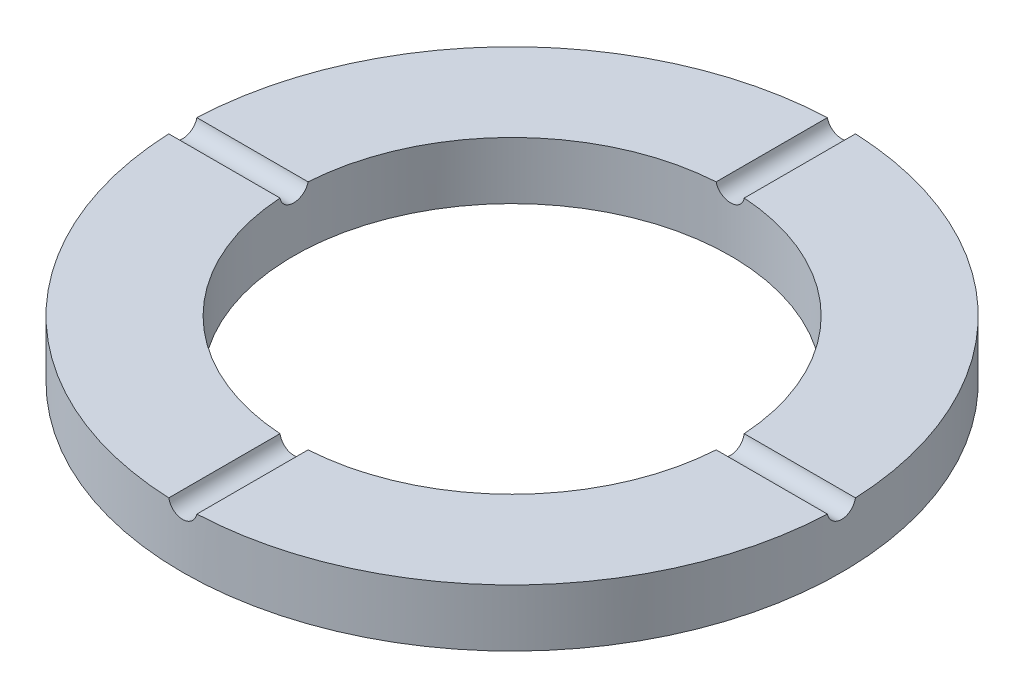
ISO-10303-21;
HEADER;
FILE_DESCRIPTION(('STEP AP214'),'2;1');
FILE_NAME('part.step','',(''),(''),'','','');
FILE_SCHEMA(('AUTOMOTIVE_DESIGN { 1 0 10303 214 1 1 1 1 }'));
ENDSEC;
DATA;
#1=APPLICATION_CONTEXT('core data for automotive mechanical design processes');
#2=APPLICATION_PROTOCOL_DEFINITION('international standard','automotive_design',2000,#1);
#3=PRODUCT_CONTEXT('',#1,'mechanical');
#4=PRODUCT('Part','Part','',(#3));
#5=PRODUCT_RELATED_PRODUCT_CATEGORY('part','',(#4));
#6=PRODUCT_DEFINITION_FORMATION('','',#4);
#7=PRODUCT_DEFINITION_CONTEXT('part definition',#1,'design');
#8=PRODUCT_DEFINITION('design','',#6,#7);
#9=PRODUCT_DEFINITION_SHAPE('','',#8);
#10=(LENGTH_UNIT() NAMED_UNIT(*) SI_UNIT(.MILLI.,.METRE.));
#11=(NAMED_UNIT(*) PLANE_ANGLE_UNIT() SI_UNIT($,.RADIAN.));
#12=(NAMED_UNIT(*) SI_UNIT($,.STERADIAN.) SOLID_ANGLE_UNIT());
#13=UNCERTAINTY_MEASURE_WITH_UNIT(LENGTH_MEASURE(1.E-05),#10,'distance_accuracy_value','');
#14=(GEOMETRIC_REPRESENTATION_CONTEXT(3) GLOBAL_UNCERTAINTY_ASSIGNED_CONTEXT((#13)) GLOBAL_UNIT_ASSIGNED_CONTEXT((#10,
#11,#12)) REPRESENTATION_CONTEXT('',''));
#15=CARTESIAN_POINT('',(0.,0.,0.));
#16=DIRECTION('',(0.,0.,1.));
#17=DIRECTION('',(1.,0.,0.));
#18=AXIS2_PLACEMENT_3D('',#15,#16,#17);
#19=CARTESIAN_POINT('',(0.,4.,0.));
#20=DIRECTION('',(0.,1.,0.));
#21=DIRECTION('',(0.,0.,1.));
#22=AXIS2_PLACEMENT_3D('',#19,#20,#21);
#23=PLANE('',#22);
#24=DIRECTION('',(1.,0.,0.));
#25=VECTOR('',#24,1.);
#26=CARTESIAN_POINT('',(-23.,4.,0.979795897113271));
#27=LINE('',#26,#25);
#28=CARTESIAN_POINT('',(-22.9791209579479,4.,0.979795897113271));
#29=VERTEX_POINT('',#28);
#30=CARTESIAN_POINT('',(-15.2184920409349,4.,0.979795897113271));
#31=VERTEX_POINT('',#30);
#32=EDGE_CURVE('E67',#29,#31,#27,.T.);
#33=ORIENTED_EDGE('',*,*,#32,.F.);
#34=CARTESIAN_POINT('',(0.,4.,0.));
#35=DIRECTION('',(0.,1.,0.));
#36=DIRECTION('',(0.,0.,1.));
#37=AXIS2_PLACEMENT_3D('',#34,#35,#36);
#38=CIRCLE('',#37,23.);
#39=CARTESIAN_POINT('',(-0.979795897113268,4.,22.9791209579479));
#40=VERTEX_POINT('',#39);
#41=EDGE_CURVE('E145',#29,#40,#38,.T.);
#42=ORIENTED_EDGE('',*,*,#41,.T.);
#43=DIRECTION('',(0.,0.,1.));
#44=VECTOR('',#43,1.);
#45=CARTESIAN_POINT('',(-0.979795897113268,4.,-23.));
#46=LINE('',#45,#44);
#47=CARTESIAN_POINT('',(-0.979795897113268,4.,15.2184920409349));
#48=VERTEX_POINT('',#47);
#49=EDGE_CURVE('E182',#48,#40,#46,.T.);
#50=ORIENTED_EDGE('',*,*,#49,.F.);
#51=CARTESIAN_POINT('',(0.,4.,0.));
#52=DIRECTION('',(0.,1.,0.));
#53=DIRECTION('',(0.,0.,1.));
#54=AXIS2_PLACEMENT_3D('',#51,#52,#53);
#55=CIRCLE('',#54,15.25);
#56=EDGE_CURVE('E134',#31,#48,#55,.T.);
#57=ORIENTED_EDGE('',*,*,#56,.F.);
#58=EDGE_LOOP('',(#33,#42,#50,#57));
#59=FACE_BOUND('',#58,.T.);
#60=ADVANCED_FACE('F41',(#59),#23,.T.);
#61=DIRECTION('',(1.,0.,0.));
#62=VECTOR('',#61,1.);
#63=CARTESIAN_POINT('',(-23.,4.,0.979795897113271));
#64=LINE('',#63,#62);
#65=CARTESIAN_POINT('',(15.2184920409349,4.,0.979795897113271));
#66=VERTEX_POINT('',#65);
#67=CARTESIAN_POINT('',(22.9791209579479,4.,0.979795897113271));
#68=VERTEX_POINT('',#67);
#69=EDGE_CURVE('E201',#66,#68,#64,.T.);
#70=ORIENTED_EDGE('',*,*,#69,.F.);
#71=CARTESIAN_POINT('',(0.979795897113275,4.,15.2184920409349));
#72=VERTEX_POINT('',#71);
#73=EDGE_CURVE('E135',#72,#66,#55,.T.);
#74=ORIENTED_EDGE('',*,*,#73,.F.);
#75=DIRECTION('',(0.,0.,1.));
#76=VECTOR('',#75,1.);
#77=CARTESIAN_POINT('',(0.979795897113275,4.,-23.));
#78=LINE('',#77,#76);
#79=CARTESIAN_POINT('',(0.979795897113275,4.,22.9791209579479));
#80=VERTEX_POINT('',#79);
#81=EDGE_CURVE('E199',#80,#72,#78,.F.);
#82=ORIENTED_EDGE('',*,*,#81,.F.);
#83=EDGE_CURVE('E149',#80,#68,#38,.T.);
#84=ORIENTED_EDGE('',*,*,#83,.T.);
#85=EDGE_LOOP('',(#70,#74,#82,#84));
#86=FACE_BOUND('',#85,.T.);
#87=ADVANCED_FACE('F228',(#86),#23,.T.);
#88=DIRECTION('',(1.,0.,0.));
#89=VECTOR('',#88,1.);
#90=CARTESIAN_POINT('',(-23.,4.,-0.979795897113271));
#91=LINE('',#90,#89);
#92=CARTESIAN_POINT('',(-15.2184920409349,4.,-0.979795897113271));
#93=VERTEX_POINT('',#92);
#94=CARTESIAN_POINT('',(-22.9791209579479,4.,-0.979795897113271));
#95=VERTEX_POINT('',#94);
#96=EDGE_CURVE('E115',#93,#95,#91,.F.);
#97=ORIENTED_EDGE('',*,*,#96,.F.);
#98=CARTESIAN_POINT('',(-0.979795897113268,4.,-15.2184920409349));
#99=VERTEX_POINT('',#98);
#100=EDGE_CURVE('E125',#99,#93,#55,.T.);
#101=ORIENTED_EDGE('',*,*,#100,.F.);
#102=CARTESIAN_POINT('',(-0.979795897113268,4.,-22.9791209579479));
#103=VERTEX_POINT('',#102);
#104=EDGE_CURVE('E193',#103,#99,#46,.T.);
#105=ORIENTED_EDGE('',*,*,#104,.F.);
#106=EDGE_CURVE('E121',#103,#95,#38,.T.);
#107=ORIENTED_EDGE('',*,*,#106,.T.);
#108=EDGE_LOOP('',(#97,#101,#105,#107));
#109=FACE_BOUND('',#108,.T.);
#110=ADVANCED_FACE('F119',(#109),#23,.T.);
#111=DIRECTION('',(1.,0.,0.));
#112=VECTOR('',#111,1.);
#113=CARTESIAN_POINT('',(-23.,4.,-0.979795897113271));
#114=LINE('',#113,#112);
#115=CARTESIAN_POINT('',(22.9791209579479,4.,-0.979795897113271));
#116=VERTEX_POINT('',#115);
#117=CARTESIAN_POINT('',(15.2184920409349,4.,-0.979795897113271));
#118=VERTEX_POINT('',#117);
#119=EDGE_CURVE('E64',#116,#118,#114,.F.);
#120=ORIENTED_EDGE('',*,*,#119,.F.);
#121=CARTESIAN_POINT('',(0.979795897113275,4.,-22.9791209579479));
#122=VERTEX_POINT('',#121);
#123=EDGE_CURVE('E147',#116,#122,#38,.T.);
#124=ORIENTED_EDGE('',*,*,#123,.T.);
#125=CARTESIAN_POINT('',(0.979795897113275,4.,-15.2184920409349));
#126=VERTEX_POINT('',#125);
#127=EDGE_CURVE('E185',#126,#122,#78,.F.);
#128=ORIENTED_EDGE('',*,*,#127,.F.);
#129=EDGE_CURVE('E126',#118,#126,#55,.T.);
#130=ORIENTED_EDGE('',*,*,#129,.F.);
#131=EDGE_LOOP('',(#120,#124,#128,#130));
#132=FACE_BOUND('',#131,.T.);
#133=ADVANCED_FACE('F227',(#132),#23,.T.);
#134=CARTESIAN_POINT('',(0.,0.,0.));
#135=DIRECTION('',(0.,1.,0.));
#136=DIRECTION('',(0.,0.,1.));
#137=AXIS2_PLACEMENT_3D('',#134,#135,#136);
#138=PLANE('',#137);
#139=CARTESIAN_POINT('',(0.,0.,0.));
#140=DIRECTION('',(0.,1.,0.));
#141=DIRECTION('',(0.,0.,1.));
#142=AXIS2_PLACEMENT_3D('',#139,#140,#141);
#143=CIRCLE('',#142,23.);
#144=CARTESIAN_POINT('',(0.,0.,23.));
#145=VERTEX_POINT('',#144);
#146=EDGE_CURVE('E140',#145,#145,#143,.T.);
#147=ORIENTED_EDGE('',*,*,#146,.F.);
#148=EDGE_LOOP('',(#147));
#149=FACE_BOUND('',#148,.T.);
#150=CARTESIAN_POINT('',(0.,0.,0.));
#151=DIRECTION('',(0.,1.,0.));
#152=DIRECTION('',(0.,0.,1.));
#153=AXIS2_PLACEMENT_3D('',#150,#151,#152);
#154=CIRCLE('',#153,15.25);
#155=CARTESIAN_POINT('',(0.,0.,15.25));
#156=VERTEX_POINT('',#155);
#157=EDGE_CURVE('E133',#156,#156,#154,.T.);
#158=ORIENTED_EDGE('',*,*,#157,.T.);
#159=EDGE_LOOP('',(#158));
#160=FACE_BOUND('',#159,.T.);
#161=ADVANCED_FACE('F231',(#149,#160),#138,.F.);
#162=CARTESIAN_POINT('',(0.,4.,0.));
#163=DIRECTION('',(0.,-1.,0.));
#164=DIRECTION('',(0.,0.,-1.));
#165=AXIS2_PLACEMENT_3D('',#162,#163,#164);
#166=CYLINDRICAL_SURFACE('',#165,23.);
#167=ORIENTED_EDGE('',*,*,#123,.F.);
#168=CARTESIAN_POINT('',(22.9791209579479,4.,-0.979795897113271));
#169=CARTESIAN_POINT('',(22.9793605933443,3.97243645561043,-0.974169331650632));
#170=CARTESIAN_POINT('',(22.9796482170886,3.94512405869499,-0.96738204484093));
#171=CARTESIAN_POINT('',(22.9803100555091,3.89116997405567,-0.951533164959077));
#172=CARTESIAN_POINT('',(22.9806842656179,3.86452825103485,-0.942471691851717));
#173=CARTESIAN_POINT('',(22.9819214042175,3.78594249574225,-0.911978649978518));
#174=CARTESIAN_POINT('',(22.9828996802334,3.73524730932459,-0.887219875909626));
#175=CARTESIAN_POINT('',(22.9850533463545,3.63873833259982,-0.829548757759613));
#176=CARTESIAN_POINT('',(22.9862288235259,3.59292671311011,-0.796632809130334));
#177=CARTESIAN_POINT('',(22.9886441298142,3.5074798753299,-0.72358328255691));
#178=CARTESIAN_POINT('',(22.9898839471065,3.46784352745809,-0.683451027520204));
#179=CARTESIAN_POINT('',(22.9922890850787,3.3958502639031,-0.597081375350443));
#180=CARTESIAN_POINT('',(22.9934543674017,3.36349707500685,-0.550840871746755));
#181=CARTESIAN_POINT('',(22.9955785967626,3.30700791783335,-0.453572897674949));
#182=CARTESIAN_POINT('',(22.9965375137627,3.28287314550116,-0.40254473188253));
#183=CARTESIAN_POINT('',(22.9981404073769,3.24352148841311,-0.297171590950273));
#184=CARTESIAN_POINT('',(22.998784480735,3.22830186395662,-0.242827640453661));
#185=CARTESIAN_POINT('',(22.9996854626633,3.20720401966329,-0.132356136819583));
#186=CARTESIAN_POINT('',(22.9999423971707,3.20132517401863,-0.0762287034278345));
#187=CARTESIAN_POINT('',(23.0000401606194,3.1990760370291,0.036170179634855));
#188=CARTESIAN_POINT('',(22.9998813329291,3.20269789927507,0.0924414721448019));
#189=CARTESIAN_POINT('',(22.9991661826682,3.21933032589601,0.203578219739285));
#190=CARTESIAN_POINT('',(22.9986098468413,3.23234120337819,0.258443627876853));
#191=CARTESIAN_POINT('',(22.9971623576244,3.26737968938369,0.365206365790732));
#192=CARTESIAN_POINT('',(22.9962712270226,3.28940668422677,0.417103897301028));
#193=CARTESIAN_POINT('',(22.9942545145306,3.3418485678543,0.516460249801761));
#194=CARTESIAN_POINT('',(22.9931289566155,3.37226259899689,0.563919523975536));
#195=CARTESIAN_POINT('',(22.9907691923438,3.44063659437221,0.65308952735128));
#196=CARTESIAN_POINT('',(22.9895349232469,3.47860093220904,0.694796900872739));
#197=CARTESIAN_POINT('',(22.9870965818358,3.56101509652297,0.771271122998882));
#198=CARTESIAN_POINT('',(22.9858925260044,3.60546837657989,0.806034252218731));
#199=CARTESIAN_POINT('',(22.9836495095539,3.69963666814406,0.867645839559928));
#200=CARTESIAN_POINT('',(22.9826107735201,3.74935868707701,0.894483572719542));
#201=CARTESIAN_POINT('',(22.9808201195405,3.85253135165495,0.939370438838652));
#202=CARTESIAN_POINT('',(22.9800675429947,3.90597309648986,0.957439779197949));
#203=CARTESIAN_POINT('',(22.9793620765943,3.97359546817615,0.974128170930274));
#204=CARTESIAN_POINT('',(22.9792358980224,3.9867728273016,0.977097597872887));
#205=CARTESIAN_POINT('',(22.9791209579479,4.,0.979795897113271));
#206=B_SPLINE_CURVE_WITH_KNOTS('',3,(#168,#169,#170,#171,#172,#173,#174,#175,#176,#177,#178,
#179,#180,#181,#182,#183,#184,#185,#186,#187,#188,#189,#190,#191,#192,#193,#194,#195,#196,#197,
#198,#199,#200,#201,#202,#203,#204,#205),.UNSPECIFIED.,.F.,.F.,(4,2,2,2,2,2,2,2,2,2,2,2,2,2,2,2,
2,2,4),(0.,0.0843470124205131,0.168689576416623,0.337100862154551,0.505586699737592,
0.674041681598095,0.842582666795663,1.01114816762904,1.17966183963974,1.34816422119762,
1.5165274844601,1.68489636260193,1.85325378265443,2.02159399318777,2.19003200229103,
2.35855998746789,2.52731499720698,2.69567922964191,2.73619196885866),.UNSPECIFIED.);
#207=EDGE_CURVE('E197',#116,#68,#206,.T.);
#208=ORIENTED_EDGE('',*,*,#207,.T.);
#209=ORIENTED_EDGE('',*,*,#83,.F.);
#210=CARTESIAN_POINT('',(0.979795897113275,4.,22.9791209579479));
#211=CARTESIAN_POINT('',(0.974169331650636,3.97243645561043,22.9793605933443));
#212=CARTESIAN_POINT('',(0.967382044840934,3.94512405869499,22.9796482170886));
#213=CARTESIAN_POINT('',(0.951533164959081,3.89116997405567,22.9803100555091));
#214=CARTESIAN_POINT('',(0.942471691851721,3.86452825103485,22.9806842656179));
#215=CARTESIAN_POINT('',(0.911978649978522,3.78594249574225,22.9819214042175));
#216=CARTESIAN_POINT('',(0.887219875909631,3.73524730932459,22.9828996802334));
#217=CARTESIAN_POINT('',(0.829548757759617,3.63873833259982,22.9850533463545));
#218=CARTESIAN_POINT('',(0.796632809130338,3.59292671311011,22.9862288235259));
#219=CARTESIAN_POINT('',(0.723583282556913,3.5074798753299,22.9886441298142));
#220=CARTESIAN_POINT('',(0.683451027520208,3.46784352745809,22.9898839471065));
#221=CARTESIAN_POINT('',(0.597081375350447,3.3958502639031,22.9922890850787));
#222=CARTESIAN_POINT('',(0.550840871746759,3.36349707500685,22.9934543674017));
#223=CARTESIAN_POINT('',(0.453572897674953,3.30700791783335,22.9955785967626));
#224=CARTESIAN_POINT('',(0.402544731882534,3.28287314550116,22.9965375137627));
#225=CARTESIAN_POINT('',(0.297171590950277,3.24352148841311,22.9981404073769));
#226=CARTESIAN_POINT('',(0.242827640453665,3.22830186395662,22.998784480735));
#227=CARTESIAN_POINT('',(0.132356136819586,3.20720401966329,22.9996854626633));
#228=CARTESIAN_POINT('',(0.0762287034278381,3.20132517401863,22.9999423971707));
#229=CARTESIAN_POINT('',(-0.0361701796348517,3.1990760370291,23.0000401606194));
#230=CARTESIAN_POINT('',(-0.0924414721447984,3.20269789927507,22.9998813329291));
#231=CARTESIAN_POINT('',(-0.203578219739281,3.21933032589601,22.9991661826682));
#232=CARTESIAN_POINT('',(-0.25844362787685,3.23234120337818,22.9986098468413));
#233=CARTESIAN_POINT('',(-0.365206365790729,3.26737968938369,22.9971623576244));
#234=CARTESIAN_POINT('',(-0.417103897301025,3.28940668422677,22.9962712270226));
#235=CARTESIAN_POINT('',(-0.516460249801758,3.3418485678543,22.9942545145306));
#236=CARTESIAN_POINT('',(-0.563919523975533,3.37226259899689,22.9931289566155));
#237=CARTESIAN_POINT('',(-0.653089527351277,3.44063659437221,22.9907691923438));
#238=CARTESIAN_POINT('',(-0.694796900872736,3.47860093220904,22.9895349232469));
#239=CARTESIAN_POINT('',(-0.771271122998879,3.56101509652297,22.9870965818358));
#240=CARTESIAN_POINT('',(-0.806034252218728,3.60546837657989,22.9858925260044));
#241=CARTESIAN_POINT('',(-0.867645839559925,3.69963666814406,22.9836495095539));
#242=CARTESIAN_POINT('',(-0.894483572719539,3.74935868707701,22.9826107735201));
#243=CARTESIAN_POINT('',(-0.939370438838649,3.85253135165495,22.9808201195405));
#244=CARTESIAN_POINT('',(-0.957439779197946,3.90597309648986,22.9800675429947));
#245=CARTESIAN_POINT('',(-0.974128170930271,3.97359546817615,22.9793620765943));
#246=CARTESIAN_POINT('',(-0.977097597872884,3.9867728273016,22.9792358980224));
#247=CARTESIAN_POINT('',(-0.979795897113268,4.,22.9791209579479));
#248=B_SPLINE_CURVE_WITH_KNOTS('',3,(#210,#211,#212,#213,#214,#215,#216,#217,#218,#219,#220,
#221,#222,#223,#224,#225,#226,#227,#228,#229,#230,#231,#232,#233,#234,#235,#236,#237,#238,#239,
#240,#241,#242,#243,#244,#245,#246,#247),.UNSPECIFIED.,.F.,.F.,(4,2,2,2,2,2,2,2,2,2,2,2,2,2,2,2,
2,2,4),(0.,0.0843470124205131,0.168689576416624,0.337100862154552,0.505586699737593,
0.674041681598095,0.842582666795664,1.01114816762904,1.17966183963974,1.34816422119763,
1.5165274844601,1.68489636260193,1.85325378265443,2.02159399318777,2.19003200229103,
2.35855998746789,2.52731499720698,2.69567922964191,2.73619196885866),.UNSPECIFIED.);
#249=EDGE_CURVE('E174',#80,#40,#248,.T.);
#250=ORIENTED_EDGE('',*,*,#249,.T.);
#251=ORIENTED_EDGE('',*,*,#41,.F.);
#252=CARTESIAN_POINT('',(-22.9791209579479,4.,0.979795897113271));
#253=CARTESIAN_POINT('',(-22.9793605933443,3.97243645561043,0.974169331650632));
#254=CARTESIAN_POINT('',(-22.9796482170886,3.94512405869499,0.96738204484093));
#255=CARTESIAN_POINT('',(-22.9803100555091,3.89116997405567,0.951533164959077));
#256=CARTESIAN_POINT('',(-22.9806842656179,3.86452825103485,0.942471691851717));
#257=CARTESIAN_POINT('',(-22.9819214042175,3.78594249574225,0.911978649978518));
#258=CARTESIAN_POINT('',(-22.9828996802334,3.73524730932459,0.887219875909626));
#259=CARTESIAN_POINT('',(-22.9850533463545,3.63873833259982,0.829548757759613));
#260=CARTESIAN_POINT('',(-22.9862288235259,3.59292671311011,0.796632809130334));
#261=CARTESIAN_POINT('',(-22.9886441298142,3.5074798753299,0.72358328255691));
#262=CARTESIAN_POINT('',(-22.9898839471065,3.46784352745809,0.683451027520204));
#263=CARTESIAN_POINT('',(-22.9922890850787,3.3958502639031,0.597081375350443));
#264=CARTESIAN_POINT('',(-22.9934543674017,3.36349707500685,0.550840871746755));
#265=CARTESIAN_POINT('',(-22.9955785967626,3.30700791783335,0.453572897674949));
#266=CARTESIAN_POINT('',(-22.9965375137627,3.28287314550116,0.40254473188253));
#267=CARTESIAN_POINT('',(-22.9981404073769,3.24352148841311,0.297171590950273));
#268=CARTESIAN_POINT('',(-22.998784480735,3.22830186395662,0.242827640453661));
#269=CARTESIAN_POINT('',(-22.9996854626633,3.20720401966329,0.132356136819583));
#270=CARTESIAN_POINT('',(-22.9999423971707,3.20132517401863,0.0762287034278345));
#271=CARTESIAN_POINT('',(-23.0000401606194,3.1990760370291,-0.036170179634855));
#272=CARTESIAN_POINT('',(-22.9998813329291,3.20269789927507,-0.0924414721448019));
#273=CARTESIAN_POINT('',(-22.9991661826682,3.21933032589601,-0.203578219739285));
#274=CARTESIAN_POINT('',(-22.9986098468413,3.23234120337819,-0.258443627876853));
#275=CARTESIAN_POINT('',(-22.9971623576244,3.26737968938369,-0.365206365790732));
#276=CARTESIAN_POINT('',(-22.9962712270226,3.28940668422677,-0.417103897301028));
#277=CARTESIAN_POINT('',(-22.9942545145306,3.3418485678543,-0.516460249801761));
#278=CARTESIAN_POINT('',(-22.9931289566155,3.37226259899689,-0.563919523975536));
#279=CARTESIAN_POINT('',(-22.9907691923438,3.44063659437221,-0.65308952735128));
#280=CARTESIAN_POINT('',(-22.9895349232469,3.47860093220904,-0.694796900872739));
#281=CARTESIAN_POINT('',(-22.9870965818358,3.56101509652297,-0.771271122998882));
#282=CARTESIAN_POINT('',(-22.9858925260044,3.60546837657989,-0.806034252218731));
#283=CARTESIAN_POINT('',(-22.9836495095539,3.69963666814406,-0.867645839559928));
#284=CARTESIAN_POINT('',(-22.9826107735201,3.74935868707701,-0.894483572719542));
#285=CARTESIAN_POINT('',(-22.9808201195405,3.85253135165495,-0.939370438838652));
#286=CARTESIAN_POINT('',(-22.9800675429947,3.90597309648986,-0.957439779197949));
#287=CARTESIAN_POINT('',(-22.9793620765943,3.97359546817615,-0.974128170930274));
#288=CARTESIAN_POINT('',(-22.9792358980224,3.9867728273016,-0.977097597872887));
#289=CARTESIAN_POINT('',(-22.9791209579479,4.,-0.979795897113271));
#290=B_SPLINE_CURVE_WITH_KNOTS('',3,(#252,#253,#254,#255,#256,#257,#258,#259,#260,#261,#262,
#263,#264,#265,#266,#267,#268,#269,#270,#271,#272,#273,#274,#275,#276,#277,#278,#279,#280,#281,
#282,#283,#284,#285,#286,#287,#288,#289),.UNSPECIFIED.,.F.,.F.,(4,2,2,2,2,2,2,2,2,2,2,2,2,2,2,2,
2,2,4),(0.,0.0843470124205131,0.168689576416623,0.337100862154551,0.505586699737592,
0.674041681598095,0.842582666795663,1.01114816762904,1.17966183963974,1.34816422119762,
1.5165274844601,1.68489636260193,1.85325378265443,2.02159399318777,2.19003200229103,
2.35855998746789,2.52731499720698,2.69567922964191,2.73619196885866),.UNSPECIFIED.);
#291=EDGE_CURVE('E214',#29,#95,#290,.T.);
#292=ORIENTED_EDGE('',*,*,#291,.T.);
#293=ORIENTED_EDGE('',*,*,#106,.F.);
#294=CARTESIAN_POINT('',(-0.979795897113268,4.,-22.9791209579479));
#295=CARTESIAN_POINT('',(-0.974169331650629,3.97243645561043,-22.9793605933443));
#296=CARTESIAN_POINT('',(-0.967382044840928,3.94512405869499,-22.9796482170886));
#297=CARTESIAN_POINT('',(-0.951533164959074,3.89116997405567,-22.9803100555091));
#298=CARTESIAN_POINT('',(-0.942471691851714,3.86452825103485,-22.9806842656179));
#299=CARTESIAN_POINT('',(-0.911978649978515,3.78594249574225,-22.9819214042175));
#300=CARTESIAN_POINT('',(-0.887219875909624,3.73524730932459,-22.9828996802334));
#301=CARTESIAN_POINT('',(-0.82954875775961,3.63873833259982,-22.9850533463545));
#302=CARTESIAN_POINT('',(-0.796632809130331,3.59292671311011,-22.9862288235259));
#303=CARTESIAN_POINT('',(-0.723583282556906,3.5074798753299,-22.9886441298142));
#304=CARTESIAN_POINT('',(-0.683451027520201,3.46784352745809,-22.9898839471065));
#305=CARTESIAN_POINT('',(-0.59708137535044,3.3958502639031,-22.9922890850787));
#306=CARTESIAN_POINT('',(-0.550840871746752,3.36349707500685,-22.9934543674017));
#307=CARTESIAN_POINT('',(-0.453572897674946,3.30700791783335,-22.9955785967626));
#308=CARTESIAN_POINT('',(-0.402544731882527,3.28287314550116,-22.9965375137627));
#309=CARTESIAN_POINT('',(-0.29717159095027,3.24352148841311,-22.9981404073769));
#310=CARTESIAN_POINT('',(-0.242827640453658,3.22830186395662,-22.998784480735));
#311=CARTESIAN_POINT('',(-0.132356136819579,3.20720401966329,-22.9996854626633));
#312=CARTESIAN_POINT('',(-0.076228703427831,3.20132517401863,-22.9999423971707));
#313=CARTESIAN_POINT('',(0.0361701796348587,3.1990760370291,-23.0000401606194));
#314=CARTESIAN_POINT('',(0.0924414721448055,3.20269789927507,-22.9998813329291));
#315=CARTESIAN_POINT('',(0.203578219739288,3.21933032589601,-22.9991661826682));
#316=CARTESIAN_POINT('',(0.258443627876857,3.23234120337818,-22.9986098468413));
#317=CARTESIAN_POINT('',(0.365206365790736,3.26737968938369,-22.9971623576244));
#318=CARTESIAN_POINT('',(0.417103897301032,3.28940668422677,-22.9962712270226));
#319=CARTESIAN_POINT('',(0.516460249801765,3.3418485678543,-22.9942545145306));
#320=CARTESIAN_POINT('',(0.563919523975539,3.37226259899689,-22.9931289566155));
#321=CARTESIAN_POINT('',(0.653089527351284,3.44063659437221,-22.9907691923438));
#322=CARTESIAN_POINT('',(0.694796900872743,3.47860093220904,-22.9895349232469));
#323=CARTESIAN_POINT('',(0.771271122998885,3.56101509652297,-22.9870965818358));
#324=CARTESIAN_POINT('',(0.806034252218735,3.60546837657989,-22.9858925260044));
#325=CARTESIAN_POINT('',(0.867645839559932,3.69963666814406,-22.9836495095539));
#326=CARTESIAN_POINT('',(0.894483572719546,3.749358687077,-22.9826107735201));
#327=CARTESIAN_POINT('',(0.939370438838656,3.85253135165495,-22.9808201195405));
#328=CARTESIAN_POINT('',(0.957439779197953,3.90597309648985,-22.9800675429947));
#329=CARTESIAN_POINT('',(0.974128170930278,3.97359546817615,-22.9793620765943));
#330=CARTESIAN_POINT('',(0.977097597872891,3.9867728273016,-22.9792358980224));
#331=CARTESIAN_POINT('',(0.979795897113275,4.,-22.9791209579479));
#332=B_SPLINE_CURVE_WITH_KNOTS('',3,(#294,#295,#296,#297,#298,#299,#300,#301,#302,#303,#304,
#305,#306,#307,#308,#309,#310,#311,#312,#313,#314,#315,#316,#317,#318,#319,#320,#321,#322,#323,
#324,#325,#326,#327,#328,#329,#330,#331),.UNSPECIFIED.,.F.,.F.,(4,2,2,2,2,2,2,2,2,2,2,2,2,2,2,2,
2,2,4),(0.,0.0843470124205131,0.168689576416624,0.337100862154552,0.505586699737593,
0.674041681598095,0.842582666795664,1.01114816762904,1.17966183963974,1.34816422119763,
1.5165274844601,1.68489636260193,1.85325378265443,2.02159399318777,2.19003200229103,
2.35855998746789,2.52731499720698,2.69567922964191,2.73619196885866),.UNSPECIFIED.);
#333=EDGE_CURVE('E184',#103,#122,#332,.T.);
#334=ORIENTED_EDGE('',*,*,#333,.T.);
#335=EDGE_LOOP('',(#167,#208,#209,#250,#251,#292,#293,#334));
#336=FACE_BOUND('',#335,.T.);
#337=ORIENTED_EDGE('',*,*,#146,.T.);
#338=EDGE_LOOP('',(#337));
#339=FACE_BOUND('',#338,.T.);
#340=ADVANCED_FACE('F43',(#336,#339),#166,.T.);
#341=CARTESIAN_POINT('',(0.,4.,0.));
#342=DIRECTION('',(0.,-1.,0.));
#343=DIRECTION('',(0.,0.,-1.));
#344=AXIS2_PLACEMENT_3D('',#341,#342,#343);
#345=CYLINDRICAL_SURFACE('',#344,15.25);
#346=CARTESIAN_POINT('',(15.2184920409349,4.,-0.979795897113271));
#347=CARTESIAN_POINT('',(15.2188538431515,3.97243901870708,-0.974169867720704));
#348=CARTESIAN_POINT('',(15.2192880787231,3.9451297093126,-0.967383426633122));
#349=CARTESIAN_POINT('',(15.2202872034669,3.89118300263032,-0.951537270318273));
#350=CARTESIAN_POINT('',(15.2208520849354,3.86454556582709,-0.94247768912793));
#351=CARTESIAN_POINT('',(15.222719395201,3.78597588331882,-0.91199304030267));
#352=CARTESIAN_POINT('',(15.224195782737,3.73529388367503,-0.887243109784854));
#353=CARTESIAN_POINT('',(15.2274454897348,3.6388132392846,-0.829598120227601));
#354=CARTESIAN_POINT('',(15.2292189321819,3.59301663007095,-0.796699684872696));
#355=CARTESIAN_POINT('',(15.2328626090531,3.50759436537019,-0.72369112526337));
#356=CARTESIAN_POINT('',(15.2347328272181,3.46796767774856,-0.683582209637176));
#357=CARTESIAN_POINT('',(15.2383620235397,3.39596272911541,-0.597234018616361));
#358=CARTESIAN_POINT('',(15.2401208731829,3.36359273637674,-0.550987844948164));
#359=CARTESIAN_POINT('',(15.2433271263638,3.30707156982903,-0.453700195268564));
#360=CARTESIAN_POINT('',(15.2447744865813,3.28292153893547,-0.402658053676759));
#361=CARTESIAN_POINT('',(15.2471934212846,3.24355053461058,-0.297265592202282));
#362=CARTESIAN_POINT('',(15.2481653015117,3.22832382209285,-0.242917423496365));
#363=CARTESIAN_POINT('',(15.2495249812882,3.20721376158707,-0.132432299956079));
#364=CARTESIAN_POINT('',(15.2499128235649,3.20132973010167,-0.0762954762837157));
#365=CARTESIAN_POINT('',(15.2500606413235,3.19907497119949,0.0360629950271532));
#366=CARTESIAN_POINT('',(15.2498218041281,3.20268625374781,0.0922842808541392));
#367=CARTESIAN_POINT('',(15.2487456511114,3.21928017180544,0.20332217774308));
#368=CARTESIAN_POINT('',(15.2479083160779,3.23226310815055,0.258138743654175));
#369=CARTESIAN_POINT('',(15.2457294941077,3.26722461888421,0.364800338763117));
#370=CARTESIAN_POINT('',(15.2443881093214,3.28920137067209,0.416645967597299));
#371=CARTESIAN_POINT('',(15.2413518364422,3.34152192978745,0.515909639590201));
#372=CARTESIAN_POINT('',(15.2396569818284,3.37186494478471,0.563328101456516));
#373=CARTESIAN_POINT('',(15.2361007662223,3.44011417675023,0.652480147579714));
#374=CARTESIAN_POINT('',(15.2342391450658,3.47803232877059,0.694204583732245));
#375=CARTESIAN_POINT('',(15.2305599783754,3.56035626309374,0.7707235282091));
#376=CARTESIAN_POINT('',(15.2287424569929,3.60476551076164,0.805514311306753));
#377=CARTESIAN_POINT('',(15.2253539907898,3.6988812344858,0.867210879044006));
#378=CARTESIAN_POINT('',(15.2237835291252,3.74859777874279,0.894101300446079));
#379=CARTESIAN_POINT('',(15.2210748731859,3.8517753168983,0.939091777244706));
#380=CARTESIAN_POINT('',(15.2199356866896,3.90522737652441,0.957212036982565));
#381=CARTESIAN_POINT('',(15.2188631647793,3.97310765105891,0.974018207757539));
#382=CARTESIAN_POINT('',(15.2186688006489,3.9865279076571,0.977047680041863));
#383=CARTESIAN_POINT('',(15.2184920409349,4.,0.979795897113271));
#384=B_SPLINE_CURVE_WITH_KNOTS('',3,(#346,#347,#348,#349,#350,#351,#352,#353,#354,#355,#356,
#357,#358,#359,#360,#361,#362,#363,#364,#365,#366,#367,#368,#369,#370,#371,#372,#373,#374,#375,
#376,#377,#378,#379,#380,#381,#382,#383),.UNSPECIFIED.,.F.,.F.,(4,2,2,2,2,2,2,2,2,2,2,2,2,2,2,2,
2,2,4),(0.,0.084342959806324,0.168680947453141,0.337077583013051,0.505544110424641,
0.673982425586326,0.842611694684202,1.01126440067291,1.17980851726698,1.34834030284328,
1.51655301450368,1.68477112613481,1.85295516515853,2.02112328171497,2.18955847637247,
2.35808392326869,2.52693495207335,2.69539511498869,2.73665997245251),.UNSPECIFIED.);
#385=EDGE_CURVE('E11',#118,#66,#384,.T.);
#386=ORIENTED_EDGE('',*,*,#385,.F.);
#387=ORIENTED_EDGE('',*,*,#129,.T.);
#388=CARTESIAN_POINT('',(-0.979795897113268,4.,-15.2184920409349));
#389=CARTESIAN_POINT('',(-0.974169867720701,3.97243901870708,-15.2188538431515));
#390=CARTESIAN_POINT('',(-0.967383426633119,3.9451297093126,-15.2192880787231));
#391=CARTESIAN_POINT('',(-0.95153727031827,3.89118300263032,-15.2202872034669));
#392=CARTESIAN_POINT('',(-0.942477689127927,3.86454556582709,-15.2208520849354));
#393=CARTESIAN_POINT('',(-0.911993040302667,3.78597588331882,-15.222719395201));
#394=CARTESIAN_POINT('',(-0.887243109784851,3.73529388367503,-15.224195782737));
#395=CARTESIAN_POINT('',(-0.829598120227598,3.6388132392846,-15.2274454897348));
#396=CARTESIAN_POINT('',(-0.796699684872693,3.59301663007095,-15.2292189321819));
#397=CARTESIAN_POINT('',(-0.723691125263367,3.50759436537019,-15.2328626090531));
#398=CARTESIAN_POINT('',(-0.683582209637172,3.46796767774856,-15.2347328272181));
#399=CARTESIAN_POINT('',(-0.597234018616357,3.3959627291154,-15.2383620235397));
#400=CARTESIAN_POINT('',(-0.550987844948161,3.36359273637674,-15.2401208731829));
#401=CARTESIAN_POINT('',(-0.45370019526856,3.30707156982903,-15.2433271263638));
#402=CARTESIAN_POINT('',(-0.402658053676756,3.28292153893547,-15.2447744865813));
#403=CARTESIAN_POINT('',(-0.297265592202278,3.24355053461058,-15.2471934212846));
#404=CARTESIAN_POINT('',(-0.242917423496362,3.22832382209285,-15.2481653015117));
#405=CARTESIAN_POINT('',(-0.132432299956075,3.20721376158707,-15.2495249812882));
#406=CARTESIAN_POINT('',(-0.0762954762837118,3.20132973010166,-15.2499128235649));
#407=CARTESIAN_POINT('',(0.0360629950271573,3.19907497119949,-15.2500606413235));
#408=CARTESIAN_POINT('',(0.0922842808541434,3.20268625374781,-15.2498218041281));
#409=CARTESIAN_POINT('',(0.203322177743084,3.21928017180544,-15.2487456511114));
#410=CARTESIAN_POINT('',(0.258138743654179,3.23226310815055,-15.2479083160779));
#411=CARTESIAN_POINT('',(0.364800338763121,3.26722461888421,-15.2457294941077));
#412=CARTESIAN_POINT('',(0.416645967597303,3.28920137067209,-15.2443881093214));
#413=CARTESIAN_POINT('',(0.515909639590205,3.34152192978745,-15.2413518364422));
#414=CARTESIAN_POINT('',(0.56332810145652,3.37186494478471,-15.2396569818284));
#415=CARTESIAN_POINT('',(0.652480147579719,3.44011417675023,-15.2361007662223));
#416=CARTESIAN_POINT('',(0.694204583732249,3.47803232877059,-15.2342391450658));
#417=CARTESIAN_POINT('',(0.770723528209104,3.56035626309374,-15.2305599783754));
#418=CARTESIAN_POINT('',(0.805514311306757,3.60476551076164,-15.2287424569929));
#419=CARTESIAN_POINT('',(0.867210879044011,3.6988812344858,-15.2253539907898));
#420=CARTESIAN_POINT('',(0.894101300446083,3.74859777874279,-15.2237835291252));
#421=CARTESIAN_POINT('',(0.93909177724471,3.8517753168983,-15.2210748731859));
#422=CARTESIAN_POINT('',(0.957212036982569,3.90522737652441,-15.2199356866896));
#423=CARTESIAN_POINT('',(0.974018207757544,3.97310765105891,-15.2188631647793));
#424=CARTESIAN_POINT('',(0.977047680041867,3.9865279076571,-15.2186688006489));
#425=CARTESIAN_POINT('',(0.979795897113276,4.,-15.2184920409349));
#426=B_SPLINE_CURVE_WITH_KNOTS('',3,(#388,#389,#390,#391,#392,#393,#394,#395,#396,#397,#398,
#399,#400,#401,#402,#403,#404,#405,#406,#407,#408,#409,#410,#411,#412,#413,#414,#415,#416,#417,
#418,#419,#420,#421,#422,#423,#424,#425),.UNSPECIFIED.,.F.,.F.,(4,2,2,2,2,2,2,2,2,2,2,2,2,2,2,2,
2,2,4),(0.,0.084342959806324,0.168680947453141,0.337077583013052,0.505544110424641,
0.673982425586327,0.842611694684203,1.01126440067291,1.17980851726698,1.34834030284328,
1.51655301450368,1.68477112613481,1.85295516515853,2.02112328171497,2.18955847637248,
2.35808392326869,2.52693495207335,2.69539511498869,2.73665997245251),.UNSPECIFIED.);
#427=EDGE_CURVE('E120',#99,#126,#426,.T.);
#428=ORIENTED_EDGE('',*,*,#427,.F.);
#429=ORIENTED_EDGE('',*,*,#100,.T.);
#430=CARTESIAN_POINT('',(-15.2184920409349,4.,0.979795897113271));
#431=CARTESIAN_POINT('',(-15.2188538431515,3.97243901870708,0.974169867720704));
#432=CARTESIAN_POINT('',(-15.2192880787231,3.9451297093126,0.967383426633122));
#433=CARTESIAN_POINT('',(-15.2202872034669,3.89118300263032,0.951537270318273));
#434=CARTESIAN_POINT('',(-15.2208520849354,3.86454556582709,0.94247768912793));
#435=CARTESIAN_POINT('',(-15.222719395201,3.78597588331882,0.91199304030267));
#436=CARTESIAN_POINT('',(-15.224195782737,3.73529388367503,0.887243109784854));
#437=CARTESIAN_POINT('',(-15.2274454897348,3.6388132392846,0.829598120227601));
#438=CARTESIAN_POINT('',(-15.2292189321819,3.59301663007095,0.796699684872696));
#439=CARTESIAN_POINT('',(-15.2328626090531,3.50759436537019,0.72369112526337));
#440=CARTESIAN_POINT('',(-15.2347328272181,3.46796767774856,0.683582209637176));
#441=CARTESIAN_POINT('',(-15.2383620235397,3.39596272911541,0.597234018616361));
#442=CARTESIAN_POINT('',(-15.2401208731829,3.36359273637674,0.550987844948164));
#443=CARTESIAN_POINT('',(-15.2433271263638,3.30707156982903,0.453700195268564));
#444=CARTESIAN_POINT('',(-15.2447744865813,3.28292153893547,0.402658053676759));
#445=CARTESIAN_POINT('',(-15.2471934212846,3.24355053461058,0.297265592202282));
#446=CARTESIAN_POINT('',(-15.2481653015117,3.22832382209285,0.242917423496365));
#447=CARTESIAN_POINT('',(-15.2495249812882,3.20721376158707,0.132432299956079));
#448=CARTESIAN_POINT('',(-15.2499128235649,3.20132973010167,0.0762954762837157));
#449=CARTESIAN_POINT('',(-15.2500606413235,3.19907497119949,-0.0360629950271532));
#450=CARTESIAN_POINT('',(-15.2498218041281,3.20268625374781,-0.0922842808541392));
#451=CARTESIAN_POINT('',(-15.2487456511114,3.21928017180544,-0.20332217774308));
#452=CARTESIAN_POINT('',(-15.2479083160779,3.23226310815055,-0.258138743654175));
#453=CARTESIAN_POINT('',(-15.2457294941077,3.26722461888421,-0.364800338763117));
#454=CARTESIAN_POINT('',(-15.2443881093214,3.28920137067209,-0.416645967597299));
#455=CARTESIAN_POINT('',(-15.2413518364422,3.34152192978745,-0.515909639590201));
#456=CARTESIAN_POINT('',(-15.2396569818284,3.37186494478471,-0.563328101456516));
#457=CARTESIAN_POINT('',(-15.2361007662223,3.44011417675023,-0.652480147579714));
#458=CARTESIAN_POINT('',(-15.2342391450658,3.47803232877059,-0.694204583732245));
#459=CARTESIAN_POINT('',(-15.2305599783754,3.56035626309374,-0.7707235282091));
#460=CARTESIAN_POINT('',(-15.2287424569929,3.60476551076164,-0.805514311306753));
#461=CARTESIAN_POINT('',(-15.2253539907898,3.6988812344858,-0.867210879044006));
#462=CARTESIAN_POINT('',(-15.2237835291252,3.74859777874279,-0.894101300446079));
#463=CARTESIAN_POINT('',(-15.2210748731859,3.8517753168983,-0.939091777244706));
#464=CARTESIAN_POINT('',(-15.2199356866896,3.90522737652441,-0.957212036982565));
#465=CARTESIAN_POINT('',(-15.2188631647793,3.97310765105891,-0.974018207757539));
#466=CARTESIAN_POINT('',(-15.2186688006489,3.9865279076571,-0.977047680041863));
#467=CARTESIAN_POINT('',(-15.2184920409349,4.,-0.979795897113271));
#468=B_SPLINE_CURVE_WITH_KNOTS('',3,(#430,#431,#432,#433,#434,#435,#436,#437,#438,#439,#440,
#441,#442,#443,#444,#445,#446,#447,#448,#449,#450,#451,#452,#453,#454,#455,#456,#457,#458,#459,
#460,#461,#462,#463,#464,#465,#466,#467),.UNSPECIFIED.,.F.,.F.,(4,2,2,2,2,2,2,2,2,2,2,2,2,2,2,2,
2,2,4),(0.,0.084342959806324,0.168680947453141,0.337077583013051,0.505544110424641,
0.673982425586326,0.842611694684202,1.01126440067291,1.17980851726698,1.34834030284328,
1.51655301450368,1.68477112613481,1.85295516515853,2.02112328171497,2.18955847637247,
2.35808392326869,2.52693495207335,2.69539511498869,2.73665997245251),.UNSPECIFIED.);
#469=EDGE_CURVE('E57',#31,#93,#468,.T.);
#470=ORIENTED_EDGE('',*,*,#469,.F.);
#471=ORIENTED_EDGE('',*,*,#56,.T.);
#472=CARTESIAN_POINT('',(0.979795897113275,4.,15.2184920409349));
#473=CARTESIAN_POINT('',(0.974169867720708,3.97243901870708,15.2188538431515));
#474=CARTESIAN_POINT('',(0.967383426633126,3.9451297093126,15.2192880787231));
#475=CARTESIAN_POINT('',(0.951537270318277,3.89118300263032,15.2202872034669));
#476=CARTESIAN_POINT('',(0.942477689127934,3.86454556582709,15.2208520849354));
#477=CARTESIAN_POINT('',(0.911993040302674,3.78597588331882,15.222719395201));
#478=CARTESIAN_POINT('',(0.887243109784858,3.73529388367503,15.224195782737));
#479=CARTESIAN_POINT('',(0.829598120227605,3.6388132392846,15.2274454897348));
#480=CARTESIAN_POINT('',(0.7966996848727,3.59301663007095,15.2292189321819));
#481=CARTESIAN_POINT('',(0.723691125263374,3.50759436537019,15.2328626090531));
#482=CARTESIAN_POINT('',(0.683582209637179,3.46796767774856,15.2347328272181));
#483=CARTESIAN_POINT('',(0.597234018616364,3.3959627291154,15.2383620235397));
#484=CARTESIAN_POINT('',(0.550987844948167,3.36359273637674,15.2401208731829));
#485=CARTESIAN_POINT('',(0.453700195268567,3.30707156982903,15.2433271263638));
#486=CARTESIAN_POINT('',(0.402658053676762,3.28292153893547,15.2447744865813));
#487=CARTESIAN_POINT('',(0.297265592202285,3.24355053461058,15.2471934212846));
#488=CARTESIAN_POINT('',(0.242917423496368,3.22832382209285,15.2481653015117));
#489=CARTESIAN_POINT('',(0.132432299956082,3.20721376158707,15.2495249812882));
#490=CARTESIAN_POINT('',(0.0762954762837186,3.20132973010166,15.2499128235649));
#491=CARTESIAN_POINT('',(-0.0360629950271504,3.19907497119949,15.2500606413235));
#492=CARTESIAN_POINT('',(-0.0922842808541365,3.20268625374781,15.2498218041281));
#493=CARTESIAN_POINT('',(-0.203322177743077,3.21928017180544,15.2487456511114));
#494=CARTESIAN_POINT('',(-0.258138743654172,3.23226310815055,15.2479083160779));
#495=CARTESIAN_POINT('',(-0.364800338763114,3.26722461888421,15.2457294941077));
#496=CARTESIAN_POINT('',(-0.416645967597297,3.28920137067209,15.2443881093214));
#497=CARTESIAN_POINT('',(-0.515909639590198,3.34152192978745,15.2413518364422));
#498=CARTESIAN_POINT('',(-0.563328101456513,3.37186494478471,15.2396569818284));
#499=CARTESIAN_POINT('',(-0.652480147579712,3.44011417675023,15.2361007662223));
#500=CARTESIAN_POINT('',(-0.694204583732242,3.47803232877059,15.2342391450658));
#501=CARTESIAN_POINT('',(-0.770723528209098,3.56035626309374,15.2305599783754));
#502=CARTESIAN_POINT('',(-0.805514311306751,3.60476551076164,15.2287424569929));
#503=CARTESIAN_POINT('',(-0.867210879044004,3.6988812344858,15.2253539907898));
#504=CARTESIAN_POINT('',(-0.894101300446077,3.74859777874279,15.2237835291252));
#505=CARTESIAN_POINT('',(-0.939091777244704,3.8517753168983,15.2210748731859));
#506=CARTESIAN_POINT('',(-0.957212036982562,3.90522737652441,15.2199356866896));
#507=CARTESIAN_POINT('',(-0.974018207757537,3.97310765105891,15.2188631647793));
#508=CARTESIAN_POINT('',(-0.97704768004186,3.9865279076571,15.2186688006489));
#509=CARTESIAN_POINT('',(-0.979795897113269,4.,15.2184920409349));
#510=B_SPLINE_CURVE_WITH_KNOTS('',3,(#472,#473,#474,#475,#476,#477,#478,#479,#480,#481,#482,
#483,#484,#485,#486,#487,#488,#489,#490,#491,#492,#493,#494,#495,#496,#497,#498,#499,#500,#501,
#502,#503,#504,#505,#506,#507,#508,#509),.UNSPECIFIED.,.F.,.F.,(4,2,2,2,2,2,2,2,2,2,2,2,2,2,2,2,
2,2,4),(0.,0.084342959806324,0.168680947453141,0.337077583013052,0.505544110424641,
0.673982425586327,0.842611694684203,1.01126440067291,1.17980851726698,1.34834030284328,
1.51655301450368,1.68477112613481,1.85295516515853,2.02112328171498,2.18955847637248,
2.35808392326869,2.52693495207335,2.69539511498869,2.73665997245251),.UNSPECIFIED.);
#511=EDGE_CURVE('E146',#72,#48,#510,.T.);
#512=ORIENTED_EDGE('',*,*,#511,.F.);
#513=ORIENTED_EDGE('',*,*,#73,.T.);
#514=EDGE_LOOP('',(#386,#387,#428,#429,#470,#471,#512,#513));
#515=FACE_BOUND('',#514,.T.);
#516=ORIENTED_EDGE('',*,*,#157,.F.);
#517=EDGE_LOOP('',(#516));
#518=FACE_BOUND('',#517,.T.);
#519=ADVANCED_FACE('F129',(#515,#518),#345,.F.);
#520=CARTESIAN_POINT('',(0.,4.2,-23.));
#521=DIRECTION('',(0.,0.,1.));
#522=DIRECTION('',(1.,0.,0.));
#523=AXIS2_PLACEMENT_3D('',#520,#521,#522);
#524=CYLINDRICAL_SURFACE('',#523,1.);
#525=ORIENTED_EDGE('',*,*,#81,.T.);
#526=ORIENTED_EDGE('',*,*,#511,.T.);
#527=ORIENTED_EDGE('',*,*,#49,.T.);
#528=ORIENTED_EDGE('',*,*,#249,.F.);
#529=EDGE_LOOP('',(#525,#526,#527,#528));
#530=FACE_BOUND('',#529,.T.);
#531=ADVANCED_FACE('F170',(#530),#524,.F.);
#532=ORIENTED_EDGE('',*,*,#104,.T.);
#533=ORIENTED_EDGE('',*,*,#427,.T.);
#534=ORIENTED_EDGE('',*,*,#127,.T.);
#535=ORIENTED_EDGE('',*,*,#333,.F.);
#536=EDGE_LOOP('',(#532,#533,#534,#535));
#537=FACE_BOUND('',#536,.T.);
#538=ADVANCED_FACE('F165',(#537),#524,.F.);
#539=CARTESIAN_POINT('',(-23.,4.2,0.));
#540=DIRECTION('',(1.,0.,0.));
#541=DIRECTION('',(0.,0.,-1.));
#542=AXIS2_PLACEMENT_3D('',#539,#540,#541);
#543=CYLINDRICAL_SURFACE('',#542,1.);
#544=ORIENTED_EDGE('',*,*,#32,.T.);
#545=ORIENTED_EDGE('',*,*,#469,.T.);
#546=ORIENTED_EDGE('',*,*,#96,.T.);
#547=ORIENTED_EDGE('',*,*,#291,.F.);
#548=EDGE_LOOP('',(#544,#545,#546,#547));
#549=FACE_BOUND('',#548,.T.);
#550=ADVANCED_FACE('F111',(#549),#543,.F.);
#551=ORIENTED_EDGE('',*,*,#119,.T.);
#552=ORIENTED_EDGE('',*,*,#385,.T.);
#553=ORIENTED_EDGE('',*,*,#69,.T.);
#554=ORIENTED_EDGE('',*,*,#207,.F.);
#555=EDGE_LOOP('',(#551,#552,#553,#554));
#556=FACE_BOUND('',#555,.T.);
#557=ADVANCED_FACE('F169',(#556),#543,.F.);
#558=CLOSED_SHELL('',(#60,#87,#110,#133,#161,#340,#519,#531,#538,#550,#557));
#559=MANIFOLD_SOLID_BREP('B2',#558);
#560=ADVANCED_BREP_SHAPE_REPRESENTATION('',(#18,#559),#14);
#561=SHAPE_DEFINITION_REPRESENTATION(#9,#560);
ENDSEC;
END-ISO-10303-21;
